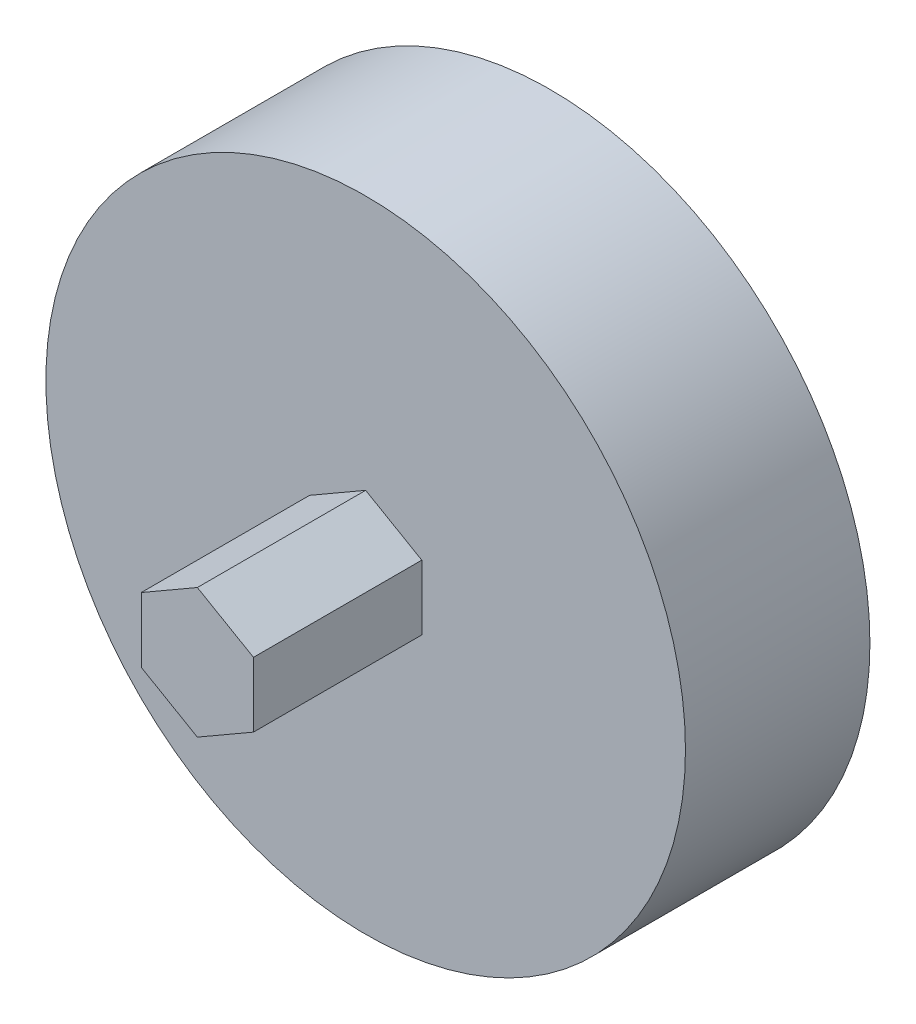
ISO-10303-21;
HEADER;
FILE_DESCRIPTION(('STEP AP214'),'2;1');
FILE_NAME('part.step','',(''),(''),'','','');
FILE_SCHEMA(('AUTOMOTIVE_DESIGN { 1 0 10303 214 1 1 1 1 }'));
ENDSEC;
DATA;
#1=APPLICATION_CONTEXT('core data for automotive mechanical design processes');
#2=APPLICATION_PROTOCOL_DEFINITION('international standard','automotive_design',2000,#1);
#3=PRODUCT_CONTEXT('',#1,'mechanical');
#4=PRODUCT('Part','Part','',(#3));
#5=PRODUCT_RELATED_PRODUCT_CATEGORY('part','',(#4));
#6=PRODUCT_DEFINITION_FORMATION('','',#4);
#7=PRODUCT_DEFINITION_CONTEXT('part definition',#1,'design');
#8=PRODUCT_DEFINITION('design','',#6,#7);
#9=PRODUCT_DEFINITION_SHAPE('','',#8);
#10=(LENGTH_UNIT() NAMED_UNIT(*) SI_UNIT(.MILLI.,.METRE.));
#11=(NAMED_UNIT(*) PLANE_ANGLE_UNIT() SI_UNIT($,.RADIAN.));
#12=(NAMED_UNIT(*) SI_UNIT($,.STERADIAN.) SOLID_ANGLE_UNIT());
#13=UNCERTAINTY_MEASURE_WITH_UNIT(LENGTH_MEASURE(1.E-05),#10,'distance_accuracy_value','');
#14=(GEOMETRIC_REPRESENTATION_CONTEXT(3) GLOBAL_UNCERTAINTY_ASSIGNED_CONTEXT((#13)) GLOBAL_UNIT_ASSIGNED_CONTEXT((#10,
#11,#12)) REPRESENTATION_CONTEXT('',''));
#15=CARTESIAN_POINT('',(0.,0.,0.));
#16=DIRECTION('',(0.,0.,1.));
#17=DIRECTION('',(1.,0.,0.));
#18=AXIS2_PLACEMENT_3D('',#15,#16,#17);
#19=CARTESIAN_POINT('',(0.,0.,20.8788));
#20=DIRECTION('',(0.,0.,-1.));
#21=DIRECTION('',(-1.,0.,0.));
#22=AXIS2_PLACEMENT_3D('',#19,#20,#21);
#23=CYLINDRICAL_SURFACE('',#22,36.195);
#24=CARTESIAN_POINT('',(0.,0.,20.8788));
#25=DIRECTION('',(0.,0.,1.));
#26=DIRECTION('',(1.,0.,0.));
#27=AXIS2_PLACEMENT_3D('',#24,#25,#26);
#28=CIRCLE('',#27,36.195);
#29=CARTESIAN_POINT('',(36.195,0.,20.8788));
#30=VERTEX_POINT('',#29);
#31=EDGE_CURVE('E11',#30,#30,#28,.T.);
#32=ORIENTED_EDGE('',*,*,#31,.F.);
#33=EDGE_LOOP('',(#32));
#34=FACE_BOUND('',#33,.T.);
#35=CARTESIAN_POINT('',(0.,0.,0.));
#36=DIRECTION('',(0.,0.,1.));
#37=DIRECTION('',(1.,0.,0.));
#38=AXIS2_PLACEMENT_3D('',#35,#36,#37);
#39=CIRCLE('',#38,36.195);
#40=CARTESIAN_POINT('',(36.195,0.,0.));
#41=VERTEX_POINT('',#40);
#42=EDGE_CURVE('E42',#41,#41,#39,.T.);
#43=ORIENTED_EDGE('',*,*,#42,.T.);
#44=EDGE_LOOP('',(#43));
#45=FACE_BOUND('',#44,.T.);
#46=ADVANCED_FACE('F39',(#34,#45),#23,.T.);
#47=CARTESIAN_POINT('',(0.,0.,20.8788));
#48=DIRECTION('',(0.,0.,1.));
#49=DIRECTION('',(1.,0.,0.));
#50=AXIS2_PLACEMENT_3D('',#47,#48,#49);
#51=PLANE('',#50);
#52=DIRECTION('',(0.866025403784439,0.5,0.));
#53=VECTOR('',#52,1.);
#54=CARTESIAN_POINT('',(0.,-7.33234841870825,20.8788));
#55=LINE('',#54,#53);
#56=CARTESIAN_POINT('',(0.,-7.33234841870825,20.8788));
#57=VERTEX_POINT('',#56);
#58=CARTESIAN_POINT('',(6.35,-3.66617420935412,20.8788));
#59=VERTEX_POINT('',#58);
#60=EDGE_CURVE('E54',#57,#59,#55,.T.);
#61=ORIENTED_EDGE('',*,*,#60,.F.);
#62=DIRECTION('',(0.866025403784438,-0.5,0.));
#63=VECTOR('',#62,1.);
#64=CARTESIAN_POINT('',(-6.35,-3.66617420935412,20.8788));
#65=LINE('',#64,#63);
#66=CARTESIAN_POINT('',(-6.35,-3.66617420935412,20.8788));
#67=VERTEX_POINT('',#66);
#68=EDGE_CURVE('E58',#67,#57,#65,.T.);
#69=ORIENTED_EDGE('',*,*,#68,.F.);
#70=DIRECTION('',(0.,-1.,0.));
#71=VECTOR('',#70,1.);
#72=CARTESIAN_POINT('',(-6.35,3.66617420935412,20.8788));
#73=LINE('',#72,#71);
#74=CARTESIAN_POINT('',(-6.35,3.66617420935412,20.8788));
#75=VERTEX_POINT('',#74);
#76=EDGE_CURVE('E138',#75,#67,#73,.T.);
#77=ORIENTED_EDGE('',*,*,#76,.F.);
#78=DIRECTION('',(-0.866025403784439,-0.5,0.));
#79=VECTOR('',#78,1.);
#80=CARTESIAN_POINT('',(0.,7.33234841870825,20.8788));
#81=LINE('',#80,#79);
#82=CARTESIAN_POINT('',(0.,7.33234841870825,20.8788));
#83=VERTEX_POINT('',#82);
#84=EDGE_CURVE('E141',#83,#75,#81,.T.);
#85=ORIENTED_EDGE('',*,*,#84,.F.);
#86=DIRECTION('',(-0.866025403784438,0.5,0.));
#87=VECTOR('',#86,1.);
#88=CARTESIAN_POINT('',(6.35,3.66617420935412,20.8788));
#89=LINE('',#88,#87);
#90=CARTESIAN_POINT('',(6.35,3.66617420935412,20.8788));
#91=VERTEX_POINT('',#90);
#92=EDGE_CURVE('E145',#91,#83,#89,.T.);
#93=ORIENTED_EDGE('',*,*,#92,.F.);
#94=DIRECTION('',(0.,1.,0.));
#95=VECTOR('',#94,1.);
#96=CARTESIAN_POINT('',(6.35,-3.66617420935412,20.8788));
#97=LINE('',#96,#95);
#98=EDGE_CURVE('E149',#59,#91,#97,.T.);
#99=ORIENTED_EDGE('',*,*,#98,.F.);
#100=EDGE_LOOP('',(#61,#69,#77,#85,#93,#99));
#101=FACE_BOUND('',#100,.T.);
#102=ORIENTED_EDGE('',*,*,#31,.T.);
#103=EDGE_LOOP('',(#102));
#104=FACE_BOUND('',#103,.T.);
#105=ADVANCED_FACE('F185',(#101,#104),#51,.T.);
#106=CARTESIAN_POINT('',(0.,0.,0.));
#107=DIRECTION('',(0.,0.,1.));
#108=DIRECTION('',(1.,0.,0.));
#109=AXIS2_PLACEMENT_3D('',#106,#107,#108);
#110=PLANE('',#109);
#111=ORIENTED_EDGE('',*,*,#42,.F.);
#112=EDGE_LOOP('',(#111));
#113=FACE_BOUND('',#112,.T.);
#114=ADVANCED_FACE('F190',(#113),#110,.F.);
#115=CARTESIAN_POINT('',(0.,-7.33234841870825,39.9288));
#116=DIRECTION('',(-0.5,0.866025403784439,0.));
#117=DIRECTION('',(-0.866025403784438,-0.5,0.));
#118=AXIS2_PLACEMENT_3D('',#115,#116,#117);
#119=PLANE('',#118);
#120=ORIENTED_EDGE('',*,*,#60,.T.);
#121=DIRECTION('',(0.,0.,-1.));
#122=VECTOR('',#121,1.);
#123=CARTESIAN_POINT('',(6.35,-3.66617420935412,39.9288));
#124=LINE('',#123,#122);
#125=CARTESIAN_POINT('',(6.35,-3.66617420935412,39.9288));
#126=VERTEX_POINT('',#125);
#127=EDGE_CURVE('E95',#126,#59,#124,.T.);
#128=ORIENTED_EDGE('',*,*,#127,.F.);
#129=DIRECTION('',(0.866025403784439,0.5,0.));
#130=VECTOR('',#129,1.);
#131=CARTESIAN_POINT('',(0.,-7.33234841870825,39.9288));
#132=LINE('',#131,#130);
#133=CARTESIAN_POINT('',(0.,-7.33234841870825,39.9288));
#134=VERTEX_POINT('',#133);
#135=EDGE_CURVE('E102',#134,#126,#132,.T.);
#136=ORIENTED_EDGE('',*,*,#135,.F.);
#137=DIRECTION('',(0.,0.,-1.));
#138=VECTOR('',#137,1.);
#139=CARTESIAN_POINT('',(0.,-7.33234841870825,39.9288));
#140=LINE('',#139,#138);
#141=EDGE_CURVE('E133',#134,#57,#140,.T.);
#142=ORIENTED_EDGE('',*,*,#141,.T.);
#143=EDGE_LOOP('',(#120,#128,#136,#142));
#144=FACE_BOUND('',#143,.T.);
#145=ADVANCED_FACE('F113',(#144),#119,.F.);
#146=CARTESIAN_POINT('',(6.35,-3.66617420935412,39.9288));
#147=DIRECTION('',(-1.,0.,0.));
#148=DIRECTION('',(0.,0.,1.));
#149=AXIS2_PLACEMENT_3D('',#146,#147,#148);
#150=PLANE('',#149);
#151=ORIENTED_EDGE('',*,*,#98,.T.);
#152=DIRECTION('',(0.,0.,-1.));
#153=VECTOR('',#152,1.);
#154=CARTESIAN_POINT('',(6.35,3.66617420935412,39.9288));
#155=LINE('',#154,#153);
#156=CARTESIAN_POINT('',(6.35,3.66617420935412,39.9288));
#157=VERTEX_POINT('',#156);
#158=EDGE_CURVE('E97',#157,#91,#155,.T.);
#159=ORIENTED_EDGE('',*,*,#158,.F.);
#160=DIRECTION('',(0.,1.,0.));
#161=VECTOR('',#160,1.);
#162=CARTESIAN_POINT('',(6.35,-3.66617420935412,39.9288));
#163=LINE('',#162,#161);
#164=EDGE_CURVE('E90',#126,#157,#163,.T.);
#165=ORIENTED_EDGE('',*,*,#164,.F.);
#166=ORIENTED_EDGE('',*,*,#127,.T.);
#167=EDGE_LOOP('',(#151,#159,#165,#166));
#168=FACE_BOUND('',#167,.T.);
#169=ADVANCED_FACE('F93',(#168),#150,.F.);
#170=CARTESIAN_POINT('',(6.35,3.66617420935412,39.9288));
#171=DIRECTION('',(-0.5,-0.866025403784439,0.));
#172=DIRECTION('',(0.866025403784438,-0.5,0.));
#173=AXIS2_PLACEMENT_3D('',#170,#171,#172);
#174=PLANE('',#173);
#175=ORIENTED_EDGE('',*,*,#92,.T.);
#176=DIRECTION('',(0.,0.,-1.));
#177=VECTOR('',#176,1.);
#178=CARTESIAN_POINT('',(0.,7.33234841870825,39.9288));
#179=LINE('',#178,#177);
#180=CARTESIAN_POINT('',(0.,7.33234841870825,39.9288));
#181=VERTEX_POINT('',#180);
#182=EDGE_CURVE('E119',#181,#83,#179,.T.);
#183=ORIENTED_EDGE('',*,*,#182,.F.);
#184=DIRECTION('',(-0.866025403784438,0.5,0.));
#185=VECTOR('',#184,1.);
#186=CARTESIAN_POINT('',(6.35,3.66617420935412,39.9288));
#187=LINE('',#186,#185);
#188=EDGE_CURVE('E101',#157,#181,#187,.T.);
#189=ORIENTED_EDGE('',*,*,#188,.F.);
#190=ORIENTED_EDGE('',*,*,#158,.T.);
#191=EDGE_LOOP('',(#175,#183,#189,#190));
#192=FACE_BOUND('',#191,.T.);
#193=ADVANCED_FACE('F167',(#192),#174,.F.);
#194=CARTESIAN_POINT('',(0.,7.33234841870825,39.9288));
#195=DIRECTION('',(0.5,-0.866025403784439,0.));
#196=DIRECTION('',(0.866025403784439,0.5,0.));
#197=AXIS2_PLACEMENT_3D('',#194,#195,#196);
#198=PLANE('',#197);
#199=ORIENTED_EDGE('',*,*,#84,.T.);
#200=DIRECTION('',(0.,0.,-1.));
#201=VECTOR('',#200,1.);
#202=CARTESIAN_POINT('',(-6.35,3.66617420935412,39.9288));
#203=LINE('',#202,#201);
#204=CARTESIAN_POINT('',(-6.35,3.66617420935412,39.9288));
#205=VERTEX_POINT('',#204);
#206=EDGE_CURVE('E125',#205,#75,#203,.T.);
#207=ORIENTED_EDGE('',*,*,#206,.F.);
#208=DIRECTION('',(-0.866025403784439,-0.5,0.));
#209=VECTOR('',#208,1.);
#210=CARTESIAN_POINT('',(0.,7.33234841870825,39.9288));
#211=LINE('',#210,#209);
#212=EDGE_CURVE('E159',#181,#205,#211,.T.);
#213=ORIENTED_EDGE('',*,*,#212,.F.);
#214=ORIENTED_EDGE('',*,*,#182,.T.);
#215=EDGE_LOOP('',(#199,#207,#213,#214));
#216=FACE_BOUND('',#215,.T.);
#217=ADVANCED_FACE('F169',(#216),#198,.F.);
#218=CARTESIAN_POINT('',(-6.35,3.66617420935412,39.9288));
#219=DIRECTION('',(1.,0.,0.));
#220=DIRECTION('',(0.,0.,-1.));
#221=AXIS2_PLACEMENT_3D('',#218,#219,#220);
#222=PLANE('',#221);
#223=ORIENTED_EDGE('',*,*,#76,.T.);
#224=DIRECTION('',(0.,0.,-1.));
#225=VECTOR('',#224,1.);
#226=CARTESIAN_POINT('',(-6.35,-3.66617420935412,39.9288));
#227=LINE('',#226,#225);
#228=CARTESIAN_POINT('',(-6.35,-3.66617420935412,39.9288));
#229=VERTEX_POINT('',#228);
#230=EDGE_CURVE('E129',#229,#67,#227,.T.);
#231=ORIENTED_EDGE('',*,*,#230,.F.);
#232=DIRECTION('',(0.,-1.,0.));
#233=VECTOR('',#232,1.);
#234=CARTESIAN_POINT('',(-6.35,3.66617420935412,39.9288));
#235=LINE('',#234,#233);
#236=EDGE_CURVE('E156',#205,#229,#235,.T.);
#237=ORIENTED_EDGE('',*,*,#236,.F.);
#238=ORIENTED_EDGE('',*,*,#206,.T.);
#239=EDGE_LOOP('',(#223,#231,#237,#238));
#240=FACE_BOUND('',#239,.T.);
#241=ADVANCED_FACE('F173',(#240),#222,.F.);
#242=CARTESIAN_POINT('',(-6.35,-3.66617420935412,39.9288));
#243=DIRECTION('',(0.5,0.866025403784438,0.));
#244=DIRECTION('',(-0.866025403784438,0.5,0.));
#245=AXIS2_PLACEMENT_3D('',#242,#243,#244);
#246=PLANE('',#245);
#247=ORIENTED_EDGE('',*,*,#68,.T.);
#248=ORIENTED_EDGE('',*,*,#141,.F.);
#249=DIRECTION('',(0.866025403784438,-0.5,0.));
#250=VECTOR('',#249,1.);
#251=CARTESIAN_POINT('',(-6.35,-3.66617420935412,39.9288));
#252=LINE('',#251,#250);
#253=EDGE_CURVE('E107',#229,#134,#252,.T.);
#254=ORIENTED_EDGE('',*,*,#253,.F.);
#255=ORIENTED_EDGE('',*,*,#230,.T.);
#256=EDGE_LOOP('',(#247,#248,#254,#255));
#257=FACE_BOUND('',#256,.T.);
#258=ADVANCED_FACE('F175',(#257),#246,.F.);
#259=CARTESIAN_POINT('',(0.,0.,39.9288));
#260=DIRECTION('',(0.,0.,1.));
#261=DIRECTION('',(1.,0.,0.));
#262=AXIS2_PLACEMENT_3D('',#259,#260,#261);
#263=PLANE('',#262);
#264=ORIENTED_EDGE('',*,*,#135,.T.);
#265=ORIENTED_EDGE('',*,*,#164,.T.);
#266=ORIENTED_EDGE('',*,*,#188,.T.);
#267=ORIENTED_EDGE('',*,*,#212,.T.);
#268=ORIENTED_EDGE('',*,*,#236,.T.);
#269=ORIENTED_EDGE('',*,*,#253,.T.);
#270=EDGE_LOOP('',(#264,#265,#266,#267,#268,#269));
#271=FACE_BOUND('',#270,.T.);
#272=ADVANCED_FACE('F105',(#271),#263,.T.);
#273=CLOSED_SHELL('',(#46,#105,#114,#145,#169,#193,#217,#241,#258,#272));
#274=MANIFOLD_SOLID_BREP('B2',#273);
#275=ADVANCED_BREP_SHAPE_REPRESENTATION('',(#18,#274),#14);
#276=SHAPE_DEFINITION_REPRESENTATION(#9,#275);
ENDSEC;
END-ISO-10303-21;
